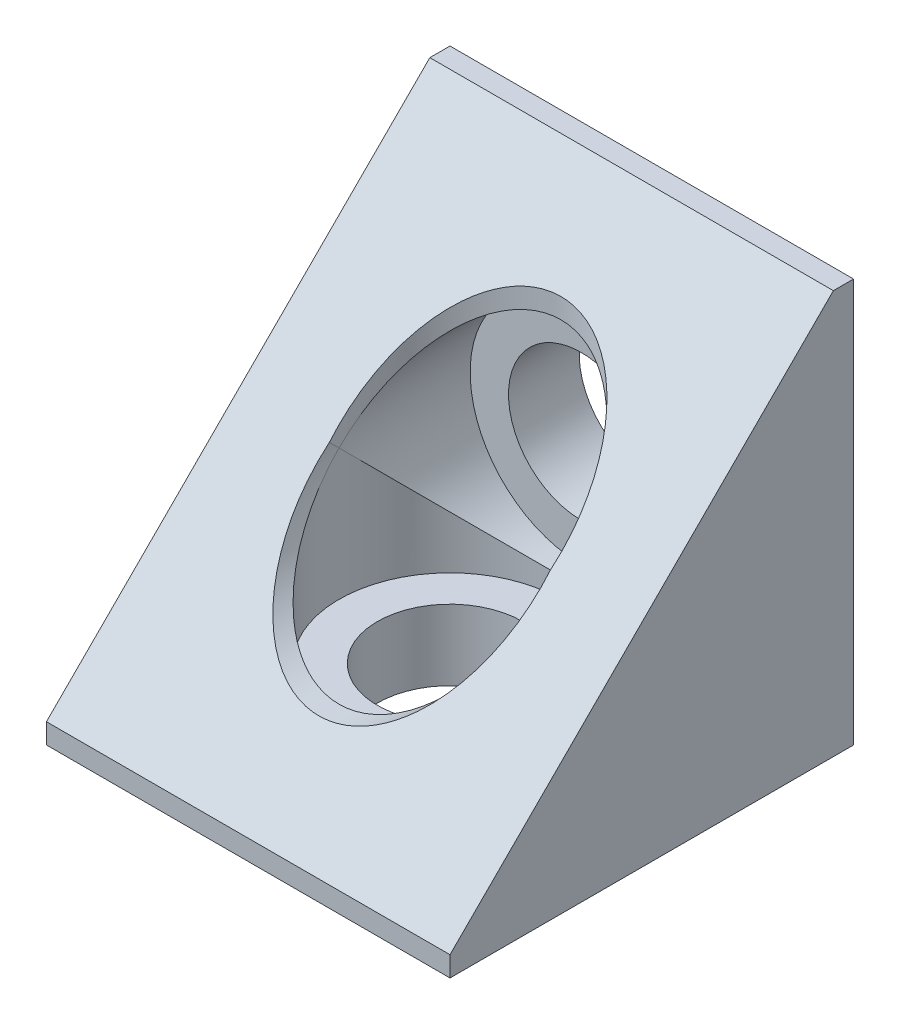
ISO-10303-21;
HEADER;
FILE_DESCRIPTION(('STEP AP214'),'2;1');
FILE_NAME('part.step','',(''),(''),'','','');
FILE_SCHEMA(('AUTOMOTIVE_DESIGN { 1 0 10303 214 1 1 1 1 }'));
ENDSEC;
DATA;
#1=APPLICATION_CONTEXT('core data for automotive mechanical design processes');
#2=APPLICATION_PROTOCOL_DEFINITION('international standard','automotive_design',2000,#1);
#3=PRODUCT_CONTEXT('',#1,'mechanical');
#4=PRODUCT('Part','Part','',(#3));
#5=PRODUCT_RELATED_PRODUCT_CATEGORY('part','',(#4));
#6=PRODUCT_DEFINITION_FORMATION('','',#4);
#7=PRODUCT_DEFINITION_CONTEXT('part definition',#1,'design');
#8=PRODUCT_DEFINITION('design','',#6,#7);
#9=PRODUCT_DEFINITION_SHAPE('','',#8);
#10=(LENGTH_UNIT() NAMED_UNIT(*) SI_UNIT(.MILLI.,.METRE.));
#11=(NAMED_UNIT(*) PLANE_ANGLE_UNIT() SI_UNIT($,.RADIAN.));
#12=(NAMED_UNIT(*) SI_UNIT($,.STERADIAN.) SOLID_ANGLE_UNIT());
#13=UNCERTAINTY_MEASURE_WITH_UNIT(LENGTH_MEASURE(1.E-05),#10,'distance_accuracy_value','');
#14=(GEOMETRIC_REPRESENTATION_CONTEXT(3) GLOBAL_UNCERTAINTY_ASSIGNED_CONTEXT((#13)) GLOBAL_UNIT_ASSIGNED_CONTEXT((#10,
#11,#12)) REPRESENTATION_CONTEXT('',''));
#15=CARTESIAN_POINT('',(0.,0.,0.));
#16=DIRECTION('',(0.,0.,1.));
#17=DIRECTION('',(1.,0.,0.));
#18=AXIS2_PLACEMENT_3D('',#15,#16,#17);
#19=CARTESIAN_POINT('',(0.,6.50000000000017,0.));
#20=DIRECTION('',(0.,-1.,0.));
#21=DIRECTION('',(0.,0.,-1.));
#22=AXIS2_PLACEMENT_3D('',#19,#20,#21);
#23=CYLINDRICAL_SURFACE('',#22,5.5);
#24=CARTESIAN_POINT('',(0.,-6.50000000000001,0.));
#25=DIRECTION('',(0.,-1.,0.));
#26=DIRECTION('',(0.,0.,-1.));
#27=AXIS2_PLACEMENT_3D('',#24,#25,#26);
#28=CIRCLE('',#27,5.5);
#29=CARTESIAN_POINT('',(0.,-6.50000000000001,-5.5));
#30=VERTEX_POINT('',#29);
#31=EDGE_CURVE('E163',#30,#30,#28,.T.);
#32=ORIENTED_EDGE('',*,*,#31,.T.);
#33=EDGE_LOOP('',(#32));
#34=FACE_BOUND('',#33,.T.);
#35=CARTESIAN_POINT('',(0.,0.,0.));
#36=DIRECTION('',(0.,-0.707106781186547,-0.707106781186547));
#37=DIRECTION('',(0.,-0.707106781186547,0.707106781186547));
#38=AXIS2_PLACEMENT_3D('',#35,#36,#37);
#39=ELLIPSE('',#38,7.77817459305203,5.5);
#40=CARTESIAN_POINT('',(-5.5,0.,0.));
#41=VERTEX_POINT('',#40);
#42=CARTESIAN_POINT('',(5.50000000000001,0.,0.));
#43=VERTEX_POINT('',#42);
#44=EDGE_CURVE('E46',#41,#43,#39,.F.);
#45=ORIENTED_EDGE('',*,*,#44,.T.);
#46=CARTESIAN_POINT('',(0.,0.,0.));
#47=DIRECTION('',(0.,-0.707106781186547,0.707106781186547));
#48=DIRECTION('',(0.,-0.707106781186547,-0.707106781186547));
#49=AXIS2_PLACEMENT_3D('',#46,#47,#48);
#50=ELLIPSE('',#49,7.77817459305203,5.5);
#51=EDGE_CURVE('E11',#43,#41,#50,.F.);
#52=ORIENTED_EDGE('',*,*,#51,.T.);
#53=EDGE_LOOP('',(#45,#52));
#54=FACE_BOUND('',#53,.T.);
#55=ADVANCED_FACE('F33',(#34,#54),#23,.F.);
#56=CARTESIAN_POINT('',(10.,-10.,10.));
#57=DIRECTION('',(0.,0.,1.));
#58=DIRECTION('',(0.,-1.,0.));
#59=AXIS2_PLACEMENT_3D('',#56,#57,#58);
#60=PLANE('',#59);
#61=DIRECTION('',(0.,1.,0.));
#62=VECTOR('',#61,1.);
#63=CARTESIAN_POINT('',(-10.,-10.,10.));
#64=LINE('',#63,#62);
#65=CARTESIAN_POINT('',(-10.,-10.,10.));
#66=VERTEX_POINT('',#65);
#67=CARTESIAN_POINT('',(-10.,-9.00000000000001,10.));
#68=VERTEX_POINT('',#67);
#69=EDGE_CURVE('E123',#66,#68,#64,.T.);
#70=ORIENTED_EDGE('',*,*,#69,.F.);
#71=DIRECTION('',(-1.,0.,0.));
#72=VECTOR('',#71,1.);
#73=CARTESIAN_POINT('',(10.,-10.,10.));
#74=LINE('',#73,#72);
#75=CARTESIAN_POINT('',(10.,-10.,10.));
#76=VERTEX_POINT('',#75);
#77=EDGE_CURVE('E55',#76,#66,#74,.T.);
#78=ORIENTED_EDGE('',*,*,#77,.F.);
#79=DIRECTION('',(0.,1.,0.));
#80=VECTOR('',#79,1.);
#81=CARTESIAN_POINT('',(10.,-10.,10.));
#82=LINE('',#81,#80);
#83=CARTESIAN_POINT('',(10.,-9.00000000000001,10.));
#84=VERTEX_POINT('',#83);
#85=EDGE_CURVE('E118',#76,#84,#82,.T.);
#86=ORIENTED_EDGE('',*,*,#85,.T.);
#87=DIRECTION('',(-1.,0.,0.));
#88=VECTOR('',#87,1.);
#89=CARTESIAN_POINT('',(10.,-9.00000000000001,10.));
#90=LINE('',#89,#88);
#91=EDGE_CURVE('E85',#84,#68,#90,.T.);
#92=ORIENTED_EDGE('',*,*,#91,.T.);
#93=EDGE_LOOP('',(#70,#78,#86,#92));
#94=FACE_BOUND('',#93,.T.);
#95=ADVANCED_FACE('F35',(#94),#60,.T.);
#96=CARTESIAN_POINT('',(10.,-10.,-10.));
#97=DIRECTION('',(0.,-1.,0.));
#98=DIRECTION('',(0.,0.,-1.));
#99=AXIS2_PLACEMENT_3D('',#96,#97,#98);
#100=PLANE('',#99);
#101=CARTESIAN_POINT('',(0.,-10.,0.));
#102=DIRECTION('',(0.,-1.,0.));
#103=DIRECTION('',(0.,0.,-1.));
#104=AXIS2_PLACEMENT_3D('',#101,#102,#103);
#105=CIRCLE('',#104,3.6);
#106=CARTESIAN_POINT('',(0.,-10.,-3.6));
#107=VERTEX_POINT('',#106);
#108=EDGE_CURVE('E142',#107,#107,#105,.T.);
#109=ORIENTED_EDGE('',*,*,#108,.F.);
#110=EDGE_LOOP('',(#109));
#111=FACE_BOUND('',#110,.T.);
#112=DIRECTION('',(0.,0.,1.));
#113=VECTOR('',#112,1.);
#114=CARTESIAN_POINT('',(-10.,-10.,-10.));
#115=LINE('',#114,#113);
#116=CARTESIAN_POINT('',(-10.,-10.,-10.));
#117=VERTEX_POINT('',#116);
#118=EDGE_CURVE('E133',#117,#66,#115,.T.);
#119=ORIENTED_EDGE('',*,*,#118,.F.);
#120=DIRECTION('',(-1.,0.,0.));
#121=VECTOR('',#120,1.);
#122=CARTESIAN_POINT('',(10.,-10.,-10.));
#123=LINE('',#122,#121);
#124=CARTESIAN_POINT('',(10.,-10.,-10.));
#125=VERTEX_POINT('',#124);
#126=EDGE_CURVE('E106',#125,#117,#123,.T.);
#127=ORIENTED_EDGE('',*,*,#126,.F.);
#128=DIRECTION('',(0.,0.,1.));
#129=VECTOR('',#128,1.);
#130=CARTESIAN_POINT('',(10.,-10.,-10.));
#131=LINE('',#130,#129);
#132=EDGE_CURVE('E113',#125,#76,#131,.T.);
#133=ORIENTED_EDGE('',*,*,#132,.T.);
#134=ORIENTED_EDGE('',*,*,#77,.T.);
#135=EDGE_LOOP('',(#119,#127,#133,#134));
#136=FACE_BOUND('',#135,.T.);
#137=ADVANCED_FACE('F190',(#111,#136),#100,.T.);
#138=CARTESIAN_POINT('',(10.,10.,-10.));
#139=DIRECTION('',(0.,0.,-1.));
#140=DIRECTION('',(-1.,0.,0.));
#141=AXIS2_PLACEMENT_3D('',#138,#139,#140);
#142=PLANE('',#141);
#143=CARTESIAN_POINT('',(0.,0.,-10.));
#144=DIRECTION('',(0.,0.,1.));
#145=DIRECTION('',(1.,0.,0.));
#146=AXIS2_PLACEMENT_3D('',#143,#144,#145);
#147=CIRCLE('',#146,3.60000000000001);
#148=CARTESIAN_POINT('',(3.60000000000001,0.,-10.));
#149=VERTEX_POINT('',#148);
#150=EDGE_CURVE('E164',#149,#149,#147,.T.);
#151=ORIENTED_EDGE('',*,*,#150,.T.);
#152=EDGE_LOOP('',(#151));
#153=FACE_BOUND('',#152,.T.);
#154=DIRECTION('',(0.,-1.,0.));
#155=VECTOR('',#154,1.);
#156=CARTESIAN_POINT('',(-10.,10.,-10.));
#157=LINE('',#156,#155);
#158=CARTESIAN_POINT('',(-10.,10.,-10.));
#159=VERTEX_POINT('',#158);
#160=EDGE_CURVE('E101',#159,#117,#157,.T.);
#161=ORIENTED_EDGE('',*,*,#160,.F.);
#162=DIRECTION('',(-1.,0.,0.));
#163=VECTOR('',#162,1.);
#164=CARTESIAN_POINT('',(10.,10.,-10.));
#165=LINE('',#164,#163);
#166=CARTESIAN_POINT('',(10.,10.,-10.));
#167=VERTEX_POINT('',#166);
#168=EDGE_CURVE('E95',#167,#159,#165,.T.);
#169=ORIENTED_EDGE('',*,*,#168,.F.);
#170=DIRECTION('',(0.,-1.,0.));
#171=VECTOR('',#170,1.);
#172=CARTESIAN_POINT('',(10.,10.,-10.));
#173=LINE('',#172,#171);
#174=EDGE_CURVE('E98',#167,#125,#173,.T.);
#175=ORIENTED_EDGE('',*,*,#174,.T.);
#176=ORIENTED_EDGE('',*,*,#126,.T.);
#177=EDGE_LOOP('',(#161,#169,#175,#176));
#178=FACE_BOUND('',#177,.T.);
#179=ADVANCED_FACE('F97',(#153,#178),#142,.T.);
#180=CARTESIAN_POINT('',(10.,9.99999999999999,-8.99999999999978));
#181=DIRECTION('',(0.,1.,0.));
#182=DIRECTION('',(0.,0.,1.));
#183=AXIS2_PLACEMENT_3D('',#180,#181,#182);
#184=PLANE('',#183);
#185=DIRECTION('',(0.,0.,-1.));
#186=VECTOR('',#185,1.);
#187=CARTESIAN_POINT('',(-10.,9.99999999999999,-8.99999999999978));
#188=LINE('',#187,#186);
#189=CARTESIAN_POINT('',(-10.,9.99999999999999,-8.99999999999978));
#190=VERTEX_POINT('',#189);
#191=EDGE_CURVE('E130',#190,#159,#188,.T.);
#192=ORIENTED_EDGE('',*,*,#191,.F.);
#193=DIRECTION('',(-1.,0.,0.));
#194=VECTOR('',#193,1.);
#195=CARTESIAN_POINT('',(10.,9.99999999999999,-8.99999999999978));
#196=LINE('',#195,#194);
#197=CARTESIAN_POINT('',(10.,9.99999999999999,-8.99999999999978));
#198=VERTEX_POINT('',#197);
#199=EDGE_CURVE('E107',#198,#190,#196,.T.);
#200=ORIENTED_EDGE('',*,*,#199,.F.);
#201=DIRECTION('',(0.,0.,-1.));
#202=VECTOR('',#201,1.);
#203=CARTESIAN_POINT('',(10.,9.99999999999999,-8.99999999999978));
#204=LINE('',#203,#202);
#205=EDGE_CURVE('E112',#198,#167,#204,.T.);
#206=ORIENTED_EDGE('',*,*,#205,.T.);
#207=ORIENTED_EDGE('',*,*,#168,.T.);
#208=EDGE_LOOP('',(#192,#200,#206,#207));
#209=FACE_BOUND('',#208,.T.);
#210=ADVANCED_FACE('F115',(#209),#184,.T.);
#211=CARTESIAN_POINT('',(10.,-9.00000000000001,10.));
#212=DIRECTION('',(0.,0.707106781186543,0.707106781186551));
#213=DIRECTION('',(0.,-0.707106781186552,0.707106781186544));
#214=AXIS2_PLACEMENT_3D('',#211,#212,#213);
#215=PLANE('',#214);
#216=CARTESIAN_POINT('',(0.,0.,1.0000000000001));
#217=DIRECTION('',(0.,0.707106781186543,0.707106781186551));
#218=DIRECTION('',(0.,-0.707106781186552,0.707106781186544));
#219=AXIS2_PLACEMENT_3D('',#216,#217,#218);
#220=ELLIPSE('',#219,7.77817459305199,5.50000000000001);
#221=CARTESIAN_POINT('',(-5.47722557505166,0.500000000000052,0.500000000000054));
#222=VERTEX_POINT('',#221);
#223=CARTESIAN_POINT('',(5.47722557505166,0.500000000000052,0.500000000000054));
#224=VERTEX_POINT('',#223);
#225=EDGE_CURVE('E162',#222,#224,#220,.T.);
#226=ORIENTED_EDGE('',*,*,#225,.F.);
#227=CARTESIAN_POINT('',(0.,1.00000000000011,0.));
#228=DIRECTION('',(0.,0.707106781186543,0.707106781186551));
#229=DIRECTION('',(0.,-0.707106781186552,0.707106781186544));
#230=AXIS2_PLACEMENT_3D('',#227,#228,#229);
#231=ELLIPSE('',#230,7.77817459305207,5.5);
#232=EDGE_CURVE('E127',#224,#222,#231,.T.);
#233=ORIENTED_EDGE('',*,*,#232,.F.);
#234=EDGE_LOOP('',(#226,#233));
#235=FACE_BOUND('',#234,.T.);
#236=DIRECTION('',(0.,0.707106781186552,-0.707106781186544));
#237=VECTOR('',#236,1.);
#238=CARTESIAN_POINT('',(-10.,-9.00000000000001,10.));
#239=LINE('',#238,#237);
#240=EDGE_CURVE('E126',#68,#190,#239,.T.);
#241=ORIENTED_EDGE('',*,*,#240,.F.);
#242=ORIENTED_EDGE('',*,*,#91,.F.);
#243=DIRECTION('',(0.,0.707106781186552,-0.707106781186544));
#244=VECTOR('',#243,1.);
#245=CARTESIAN_POINT('',(10.,-9.00000000000001,10.));
#246=LINE('',#245,#244);
#247=EDGE_CURVE('E116',#84,#198,#246,.T.);
#248=ORIENTED_EDGE('',*,*,#247,.T.);
#249=ORIENTED_EDGE('',*,*,#199,.T.);
#250=EDGE_LOOP('',(#241,#242,#248,#249));
#251=FACE_BOUND('',#250,.T.);
#252=ADVANCED_FACE('F161',(#235,#251),#215,.T.);
#253=CARTESIAN_POINT('',(10.,0.,0.));
#254=DIRECTION('',(-1.,0.,0.));
#255=DIRECTION('',(0.,0.,1.));
#256=AXIS2_PLACEMENT_3D('',#253,#254,#255);
#257=PLANE('',#256);
#258=ORIENTED_EDGE('',*,*,#85,.F.);
#259=ORIENTED_EDGE('',*,*,#132,.F.);
#260=ORIENTED_EDGE('',*,*,#174,.F.);
#261=ORIENTED_EDGE('',*,*,#205,.F.);
#262=ORIENTED_EDGE('',*,*,#247,.F.);
#263=EDGE_LOOP('',(#258,#259,#260,#261,#262));
#264=FACE_BOUND('',#263,.T.);
#265=ADVANCED_FACE('F111',(#264),#257,.F.);
#266=CARTESIAN_POINT('',(-10.,0.,0.));
#267=DIRECTION('',(-1.,0.,0.));
#268=DIRECTION('',(0.,0.,1.));
#269=AXIS2_PLACEMENT_3D('',#266,#267,#268);
#270=PLANE('',#269);
#271=ORIENTED_EDGE('',*,*,#69,.T.);
#272=ORIENTED_EDGE('',*,*,#240,.T.);
#273=ORIENTED_EDGE('',*,*,#191,.T.);
#274=ORIENTED_EDGE('',*,*,#160,.T.);
#275=ORIENTED_EDGE('',*,*,#118,.T.);
#276=EDGE_LOOP('',(#271,#272,#273,#274,#275));
#277=FACE_BOUND('',#276,.T.);
#278=ADVANCED_FACE('F196',(#277),#270,.T.);
#279=CARTESIAN_POINT('',(0.,0.,0.));
#280=DIRECTION('',(0.,-0.707106781186547,-0.707106781186547));
#281=DIRECTION('',(0.,-0.707106781186547,0.707106781186547));
#282=AXIS2_PLACEMENT_3D('',#279,#280,#281);
#283=ELLIPSE('',#282,7.77817459305203,5.5);
#284=EDGE_CURVE('E144',#41,#43,#283,.T.);
#285=ORIENTED_EDGE('',*,*,#284,.T.);
#286=CARTESIAN_POINT('',(0.,0.,0.));
#287=DIRECTION('',(0.,-0.707106781186547,0.707106781186547));
#288=DIRECTION('',(0.,-0.707106781186547,-0.707106781186547));
#289=AXIS2_PLACEMENT_3D('',#286,#287,#288);
#290=ELLIPSE('',#289,7.77817459305203,5.5);
#291=EDGE_CURVE('E41',#43,#224,#290,.T.);
#292=ORIENTED_EDGE('',*,*,#291,.T.);
#293=ORIENTED_EDGE('',*,*,#232,.T.);
#294=EDGE_CURVE('E146',#222,#41,#290,.T.);
#295=ORIENTED_EDGE('',*,*,#294,.T.);
#296=EDGE_LOOP('',(#285,#292,#293,#295));
#297=FACE_BOUND('',#296,.T.);
#298=ADVANCED_FACE('F153',(#297),#23,.F.);
#299=CARTESIAN_POINT('',(0.,6.50000000000017,0.));
#300=DIRECTION('',(0.,-1.,0.));
#301=DIRECTION('',(0.,0.,-1.));
#302=AXIS2_PLACEMENT_3D('',#299,#300,#301);
#303=CYLINDRICAL_SURFACE('',#302,3.6);
#304=CARTESIAN_POINT('',(0.,-6.50000000000001,0.));
#305=DIRECTION('',(0.,-1.,0.));
#306=DIRECTION('',(0.,0.,-1.));
#307=AXIS2_PLACEMENT_3D('',#304,#305,#306);
#308=CIRCLE('',#307,3.6);
#309=CARTESIAN_POINT('',(0.,-6.50000000000001,-3.6));
#310=VERTEX_POINT('',#309);
#311=EDGE_CURVE('E307',#310,#310,#308,.T.);
#312=ORIENTED_EDGE('',*,*,#311,.F.);
#313=EDGE_LOOP('',(#312));
#314=FACE_BOUND('',#313,.T.);
#315=ORIENTED_EDGE('',*,*,#108,.T.);
#316=EDGE_LOOP('',(#315));
#317=FACE_BOUND('',#316,.T.);
#318=ADVANCED_FACE('F195',(#314,#317),#303,.F.);
#319=CARTESIAN_POINT('',(0.,-6.5,-3.6));
#320=DIRECTION('',(0.,-1.,0.));
#321=DIRECTION('',(0.,0.,-1.));
#322=AXIS2_PLACEMENT_3D('',#319,#320,#321);
#323=PLANE('',#322);
#324=ORIENTED_EDGE('',*,*,#31,.F.);
#325=EDGE_LOOP('',(#324));
#326=FACE_BOUND('',#325,.T.);
#327=ORIENTED_EDGE('',*,*,#311,.T.);
#328=EDGE_LOOP('',(#327));
#329=FACE_BOUND('',#328,.T.);
#330=ADVANCED_FACE('F181',(#326,#329),#323,.F.);
#331=CARTESIAN_POINT('',(0.,0.,6.50000000000004));
#332=DIRECTION('',(0.,0.,1.));
#333=DIRECTION('',(1.,0.,0.));
#334=AXIS2_PLACEMENT_3D('',#331,#332,#333);
#335=CYLINDRICAL_SURFACE('',#334,5.50000000000001);
#336=ORIENTED_EDGE('',*,*,#225,.T.);
#337=ORIENTED_EDGE('',*,*,#291,.F.);
#338=ORIENTED_EDGE('',*,*,#44,.F.);
#339=ORIENTED_EDGE('',*,*,#294,.F.);
#340=EDGE_LOOP('',(#336,#337,#338,#339));
#341=FACE_BOUND('',#340,.T.);
#342=ADVANCED_FACE('F166',(#341),#335,.F.);
#343=CARTESIAN_POINT('',(0.,0.,-6.5));
#344=DIRECTION('',(0.,0.,1.));
#345=DIRECTION('',(1.,0.,0.));
#346=AXIS2_PLACEMENT_3D('',#343,#344,#345);
#347=CIRCLE('',#346,5.50000000000001);
#348=CARTESIAN_POINT('',(5.50000000000001,0.,-6.5));
#349=VERTEX_POINT('',#348);
#350=EDGE_CURVE('E300',#349,#349,#347,.T.);
#351=ORIENTED_EDGE('',*,*,#350,.F.);
#352=EDGE_LOOP('',(#351));
#353=FACE_BOUND('',#352,.T.);
#354=ORIENTED_EDGE('',*,*,#284,.F.);
#355=ORIENTED_EDGE('',*,*,#51,.F.);
#356=EDGE_LOOP('',(#354,#355));
#357=FACE_BOUND('',#356,.T.);
#358=ADVANCED_FACE('F169',(#353,#357),#335,.F.);
#359=CARTESIAN_POINT('',(0.,0.,6.50000000000004));
#360=DIRECTION('',(0.,0.,1.));
#361=DIRECTION('',(1.,0.,0.));
#362=AXIS2_PLACEMENT_3D('',#359,#360,#361);
#363=CYLINDRICAL_SURFACE('',#362,3.60000000000001);
#364=ORIENTED_EDGE('',*,*,#150,.F.);
#365=EDGE_LOOP('',(#364));
#366=FACE_BOUND('',#365,.T.);
#367=CARTESIAN_POINT('',(0.,0.,-6.5));
#368=DIRECTION('',(0.,0.,1.));
#369=DIRECTION('',(1.,0.,0.));
#370=AXIS2_PLACEMENT_3D('',#367,#368,#369);
#371=CIRCLE('',#370,3.60000000000001);
#372=CARTESIAN_POINT('',(3.60000000000001,0.,-6.5));
#373=VERTEX_POINT('',#372);
#374=EDGE_CURVE('E298',#373,#373,#371,.T.);
#375=ORIENTED_EDGE('',*,*,#374,.T.);
#376=EDGE_LOOP('',(#375));
#377=FACE_BOUND('',#376,.T.);
#378=ADVANCED_FACE('F171',(#366,#377),#363,.F.);
#379=CARTESIAN_POINT('',(3.60000000000001,0.,-6.5));
#380=DIRECTION('',(0.,0.,-1.));
#381=DIRECTION('',(-1.,0.,0.));
#382=AXIS2_PLACEMENT_3D('',#379,#380,#381);
#383=PLANE('',#382);
#384=ORIENTED_EDGE('',*,*,#374,.F.);
#385=EDGE_LOOP('',(#384));
#386=FACE_BOUND('',#385,.T.);
#387=ORIENTED_EDGE('',*,*,#350,.T.);
#388=EDGE_LOOP('',(#387));
#389=FACE_BOUND('',#388,.T.);
#390=ADVANCED_FACE('F178',(#386,#389),#383,.F.);
#391=CLOSED_SHELL('',(#55,#95,#137,#179,#210,#252,#265,#278,#298,#318,#330,#342,#358,#378,#390));
#392=MANIFOLD_SOLID_BREP('B2',#391);
#393=ADVANCED_BREP_SHAPE_REPRESENTATION('',(#18,#392),#14);
#394=SHAPE_DEFINITION_REPRESENTATION(#9,#393);
ENDSEC;
END-ISO-10303-21;
